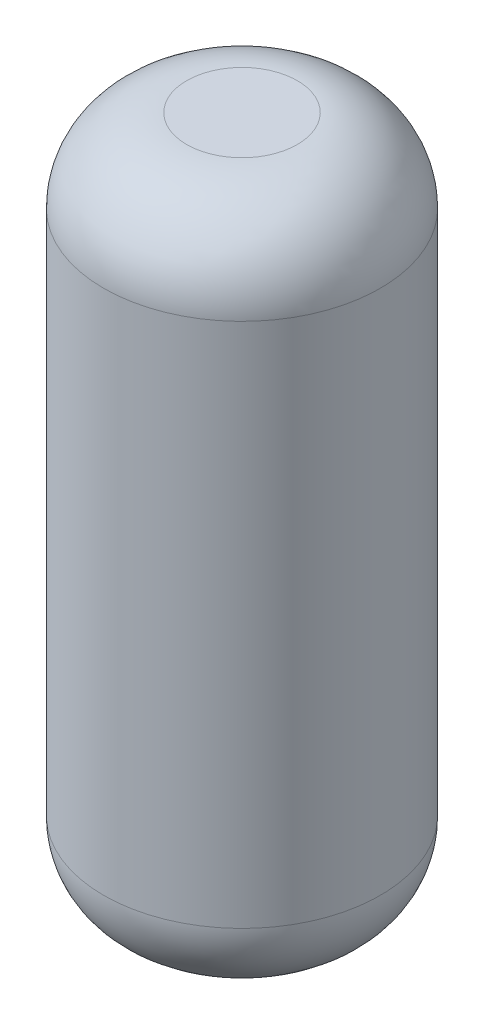
ISO-10303-21;
HEADER;
FILE_DESCRIPTION(('STEP AP214'),'2;1');
FILE_NAME('part.step','',(''),(''),'','','');
FILE_SCHEMA(('AUTOMOTIVE_DESIGN { 1 0 10303 214 1 1 1 1 }'));
ENDSEC;
DATA;
#1=APPLICATION_CONTEXT('core data for automotive mechanical design processes');
#2=APPLICATION_PROTOCOL_DEFINITION('international standard','automotive_design',2000,#1);
#3=PRODUCT_CONTEXT('',#1,'mechanical');
#4=PRODUCT('Part','Part','',(#3));
#5=PRODUCT_RELATED_PRODUCT_CATEGORY('part','',(#4));
#6=PRODUCT_DEFINITION_FORMATION('','',#4);
#7=PRODUCT_DEFINITION_CONTEXT('part definition',#1,'design');
#8=PRODUCT_DEFINITION('design','',#6,#7);
#9=PRODUCT_DEFINITION_SHAPE('','',#8);
#10=(LENGTH_UNIT() NAMED_UNIT(*) SI_UNIT(.MILLI.,.METRE.));
#11=(NAMED_UNIT(*) PLANE_ANGLE_UNIT() SI_UNIT($,.RADIAN.));
#12=(NAMED_UNIT(*) SI_UNIT($,.STERADIAN.) SOLID_ANGLE_UNIT());
#13=UNCERTAINTY_MEASURE_WITH_UNIT(LENGTH_MEASURE(1.E-05),#10,'distance_accuracy_value','');
#14=(GEOMETRIC_REPRESENTATION_CONTEXT(3) GLOBAL_UNCERTAINTY_ASSIGNED_CONTEXT((#13)) GLOBAL_UNIT_ASSIGNED_CONTEXT((#10,
#11,#12)) REPRESENTATION_CONTEXT('',''));
#15=CARTESIAN_POINT('',(0.,0.,0.));
#16=DIRECTION('',(0.,0.,1.));
#17=DIRECTION('',(1.,0.,0.));
#18=AXIS2_PLACEMENT_3D('',#15,#16,#17);
#19=CARTESIAN_POINT('',(0.,25.,0.));
#20=DIRECTION('',(0.,-1.,0.));
#21=DIRECTION('',(0.,0.,-1.));
#22=AXIS2_PLACEMENT_3D('',#19,#20,#21);
#23=CYLINDRICAL_SURFACE('',#22,5.);
#24=CARTESIAN_POINT('',(0.,3.,0.));
#25=DIRECTION('',(0.,1.,0.));
#26=DIRECTION('',(0.,0.,1.));
#27=AXIS2_PLACEMENT_3D('',#24,#25,#26);
#28=CIRCLE('',#27,5.);
#29=CARTESIAN_POINT('',(0.,3.,5.));
#30=VERTEX_POINT('',#29);
#31=EDGE_CURVE('E50',#30,#30,#28,.T.);
#32=ORIENTED_EDGE('',*,*,#31,.T.);
#33=EDGE_LOOP('',(#32));
#34=FACE_BOUND('',#33,.T.);
#35=CARTESIAN_POINT('',(0.,22.,0.));
#36=DIRECTION('',(0.,1.,0.));
#37=DIRECTION('',(0.,0.,1.));
#38=AXIS2_PLACEMENT_3D('',#35,#36,#37);
#39=CIRCLE('',#38,5.);
#40=CARTESIAN_POINT('',(0.,22.,5.));
#41=VERTEX_POINT('',#40);
#42=EDGE_CURVE('E54',#41,#41,#39,.F.);
#43=ORIENTED_EDGE('',*,*,#42,.T.);
#44=EDGE_LOOP('',(#43));
#45=FACE_BOUND('',#44,.T.);
#46=ADVANCED_FACE('F39',(#34,#45),#23,.T.);
#47=CARTESIAN_POINT('',(0.,25.,0.));
#48=DIRECTION('',(0.,1.,0.));
#49=DIRECTION('',(0.,0.,1.));
#50=AXIS2_PLACEMENT_3D('',#47,#48,#49);
#51=PLANE('',#50);
#52=CARTESIAN_POINT('',(0.,25.,0.));
#53=DIRECTION('',(0.,1.,0.));
#54=DIRECTION('',(0.,0.,1.));
#55=AXIS2_PLACEMENT_3D('',#52,#53,#54);
#56=CIRCLE('',#55,2.);
#57=CARTESIAN_POINT('',(0.,25.,2.));
#58=VERTEX_POINT('',#57);
#59=EDGE_CURVE('E10',#58,#58,#56,.T.);
#60=ORIENTED_EDGE('',*,*,#59,.T.);
#61=EDGE_LOOP('',(#60));
#62=FACE_BOUND('',#61,.T.);
#63=ADVANCED_FACE('F70',(#62),#51,.T.);
#64=CARTESIAN_POINT('',(0.,0.,0.));
#65=DIRECTION('',(0.,1.,0.));
#66=DIRECTION('',(0.,0.,1.));
#67=AXIS2_PLACEMENT_3D('',#64,#65,#66);
#68=PLANE('',#67);
#69=CARTESIAN_POINT('',(0.,0.,0.));
#70=DIRECTION('',(0.,1.,0.));
#71=DIRECTION('',(0.,0.,1.));
#72=AXIS2_PLACEMENT_3D('',#69,#70,#71);
#73=CIRCLE('',#72,2.);
#74=CARTESIAN_POINT('',(0.,0.,2.));
#75=VERTEX_POINT('',#74);
#76=EDGE_CURVE('E46',#75,#75,#73,.F.);
#77=ORIENTED_EDGE('',*,*,#76,.T.);
#78=EDGE_LOOP('',(#77));
#79=FACE_BOUND('',#78,.T.);
#80=ADVANCED_FACE('F67',(#79),#68,.F.);
#81=CARTESIAN_POINT('',(0.,3.,0.));
#82=DIRECTION('',(0.,1.,0.));
#83=DIRECTION('',(0.,0.,1.));
#84=AXIS2_PLACEMENT_3D('',#81,#82,#83);
#85=DEGENERATE_TOROIDAL_SURFACE('',#84,2.,3.,.T.);
#86=ORIENTED_EDGE('',*,*,#76,.F.);
#87=EDGE_LOOP('',(#86));
#88=FACE_BOUND('',#87,.T.);
#89=ORIENTED_EDGE('',*,*,#31,.F.);
#90=EDGE_LOOP('',(#89));
#91=FACE_BOUND('',#90,.T.);
#92=ADVANCED_FACE('F63',(#88,#91),#85,.T.);
#93=CARTESIAN_POINT('',(0.,22.,0.));
#94=DIRECTION('',(0.,1.,0.));
#95=DIRECTION('',(0.,0.,1.));
#96=AXIS2_PLACEMENT_3D('',#93,#94,#95);
#97=DEGENERATE_TOROIDAL_SURFACE('',#96,2.,3.,.T.);
#98=ORIENTED_EDGE('',*,*,#42,.F.);
#99=EDGE_LOOP('',(#98));
#100=FACE_BOUND('',#99,.T.);
#101=ORIENTED_EDGE('',*,*,#59,.F.);
#102=EDGE_LOOP('',(#101));
#103=FACE_BOUND('',#102,.T.);
#104=ADVANCED_FACE('F41',(#100,#103),#97,.T.);
#105=CLOSED_SHELL('',(#46,#63,#80,#92,#104));
#106=MANIFOLD_SOLID_BREP('B2',#105);
#107=ADVANCED_BREP_SHAPE_REPRESENTATION('',(#18,#106),#14);
#108=SHAPE_DEFINITION_REPRESENTATION(#9,#107);
ENDSEC;
END-ISO-10303-21;
